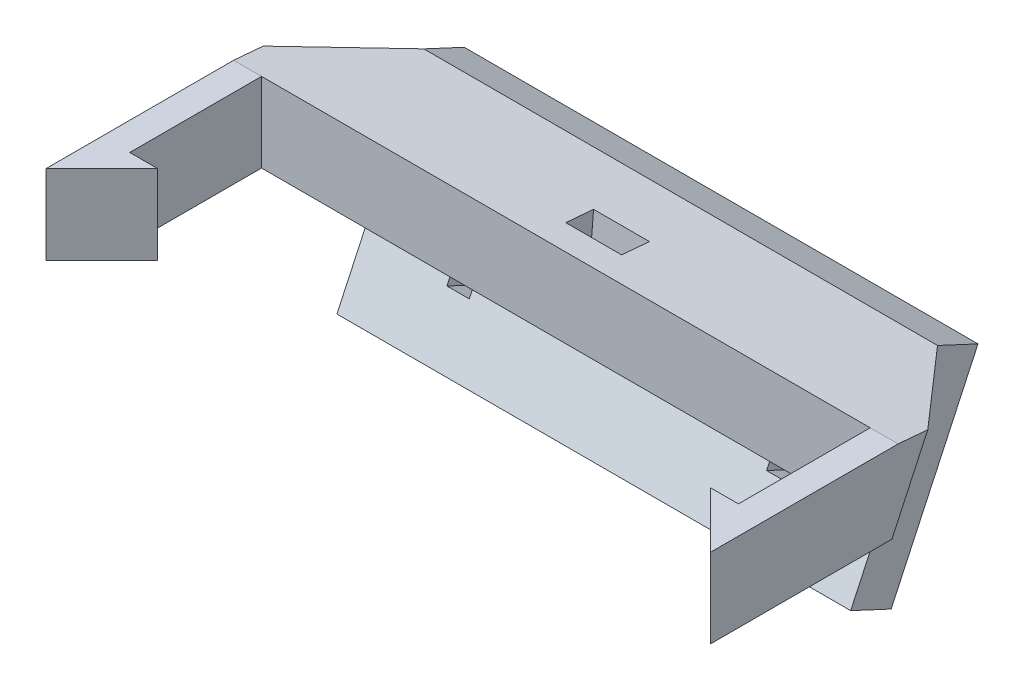
ISO-10303-21;
HEADER;
FILE_DESCRIPTION(('STEP AP214'),'2;1');
FILE_NAME('part.step','',(''),(''),'','','');
FILE_SCHEMA(('AUTOMOTIVE_DESIGN { 1 0 10303 214 1 1 1 1 }'));
ENDSEC;
DATA;
#1=APPLICATION_CONTEXT('core data for automotive mechanical design processes');
#2=APPLICATION_PROTOCOL_DEFINITION('international standard','automotive_design',2000,#1);
#3=PRODUCT_CONTEXT('',#1,'mechanical');
#4=PRODUCT('Part','Part','',(#3));
#5=PRODUCT_RELATED_PRODUCT_CATEGORY('part','',(#4));
#6=PRODUCT_DEFINITION_FORMATION('','',#4);
#7=PRODUCT_DEFINITION_CONTEXT('part definition',#1,'design');
#8=PRODUCT_DEFINITION('design','',#6,#7);
#9=PRODUCT_DEFINITION_SHAPE('','',#8);
#10=(LENGTH_UNIT() NAMED_UNIT(*) SI_UNIT(.MILLI.,.METRE.));
#11=(NAMED_UNIT(*) PLANE_ANGLE_UNIT() SI_UNIT($,.RADIAN.));
#12=(NAMED_UNIT(*) SI_UNIT($,.STERADIAN.) SOLID_ANGLE_UNIT());
#13=UNCERTAINTY_MEASURE_WITH_UNIT(LENGTH_MEASURE(1.E-05),#10,'distance_accuracy_value','');
#14=(GEOMETRIC_REPRESENTATION_CONTEXT(3) GLOBAL_UNCERTAINTY_ASSIGNED_CONTEXT((#13)) GLOBAL_UNIT_ASSIGNED_CONTEXT((#10,
#11,#12)) REPRESENTATION_CONTEXT('',''));
#15=CARTESIAN_POINT('',(0.,0.,0.));
#16=DIRECTION('',(0.,0.,1.));
#17=DIRECTION('',(1.,0.,0.));
#18=AXIS2_PLACEMENT_3D('',#15,#16,#17);
#19=CARTESIAN_POINT('',(37.7825,3.39860036747243,-13.0507435403567));
#20=DIRECTION('',(0.,-0.996366443360063,0.0851698922508354));
#21=DIRECTION('',(0.,-0.0851698922508354,-0.996366443360063));
#22=AXIS2_PLACEMENT_3D('',#19,#20,#21);
#23=PLANE('',#22);
#24=DIRECTION('',(0.,0.0851698922508354,0.996366443360063));
#25=VECTOR('',#24,1.);
#26=CARTESIAN_POINT('',(37.7825,3.39860036747243,-13.0507435403567));
#27=LINE('',#26,#25);
#28=CARTESIAN_POINT('',(37.7825,4.22620582678409,-3.36893831309177));
#29=VERTEX_POINT('',#28);
#30=CARTESIAN_POINT('',(37.7825,4.51418432609816,0.));
#31=VERTEX_POINT('',#30);
#32=EDGE_CURVE('E370',#29,#31,#27,.T.);
#33=ORIENTED_EDGE('',*,*,#32,.F.);
#34=DIRECTION('',(-0.661559883250847,-0.0638682497567785,-0.747167563232058));
#35=VECTOR('',#34,1.);
#36=CARTESIAN_POINT('',(32.9618530298151,3.76081139692824,-8.81339034397362));
#37=LINE('',#36,#35);
#38=CARTESIAN_POINT('',(29.21,3.39860036747242,-13.0507435403567));
#39=VERTEX_POINT('',#38);
#40=EDGE_CURVE('E310',#29,#39,#37,.T.);
#41=ORIENTED_EDGE('',*,*,#40,.T.);
#42=DIRECTION('',(1.,0.,0.));
#43=VECTOR('',#42,1.);
#44=CARTESIAN_POINT('',(37.7825,3.39860036747242,-13.0507435403567));
#45=LINE('',#44,#43);
#46=CARTESIAN_POINT('',(-29.21,3.39860036747242,-13.0507435403567));
#47=VERTEX_POINT('',#46);
#48=EDGE_CURVE('E376',#47,#39,#45,.T.);
#49=ORIENTED_EDGE('',*,*,#48,.F.);
#50=DIRECTION('',(-0.661559883250847,0.0638682497567785,0.747167563232058));
#51=VECTOR('',#50,1.);
#52=CARTESIAN_POINT('',(0.110036640407145,0.567988248391787,-46.164874075054));
#53=LINE('',#52,#51);
#54=CARTESIAN_POINT('',(-37.7825,4.22620582678409,-3.36893831309177));
#55=VERTEX_POINT('',#54);
#56=EDGE_CURVE('E329',#47,#55,#53,.T.);
#57=ORIENTED_EDGE('',*,*,#56,.T.);
#58=DIRECTION('',(0.,0.0851698922508354,0.996366443360063));
#59=VECTOR('',#58,1.);
#60=CARTESIAN_POINT('',(-37.7825,3.39860036747243,-13.0507435403567));
#61=LINE('',#60,#59);
#62=CARTESIAN_POINT('',(-37.7825,4.51418432609816,0.));
#63=VERTEX_POINT('',#62);
#64=EDGE_CURVE('E367',#55,#63,#61,.T.);
#65=ORIENTED_EDGE('',*,*,#64,.T.);
#66=DIRECTION('',(-1.,0.,0.));
#67=VECTOR('',#66,1.);
#68=CARTESIAN_POINT('',(-37.7825,4.51418432609816,0.));
#69=LINE('',#68,#67);
#70=CARTESIAN_POINT('',(-34.6075,4.51418432609816,0.));
#71=VERTEX_POINT('',#70);
#72=EDGE_CURVE('E445',#71,#63,#69,.T.);
#73=ORIENTED_EDGE('',*,*,#72,.F.);
#74=DIRECTION('',(-1.,0.,0.));
#75=VECTOR('',#74,1.);
#76=CARTESIAN_POINT('',(37.7825,4.51418432609816,0.));
#77=LINE('',#76,#75);
#78=CARTESIAN_POINT('',(34.6075,4.51418432609816,0.));
#79=VERTEX_POINT('',#78);
#80=EDGE_CURVE('E372',#79,#71,#77,.T.);
#81=ORIENTED_EDGE('',*,*,#80,.F.);
#82=DIRECTION('',(-1.,0.,0.));
#83=VECTOR('',#82,1.);
#84=CARTESIAN_POINT('',(37.7825,4.51418432609816,0.));
#85=LINE('',#84,#83);
#86=EDGE_CURVE('E416',#31,#79,#85,.T.);
#87=ORIENTED_EDGE('',*,*,#86,.F.);
#88=EDGE_LOOP('',(#33,#41,#49,#57,#65,#73,#81,#87));
#89=FACE_BOUND('',#88,.T.);
#90=DIRECTION('',(0.,0.0851698922508354,0.996366443360063));
#91=VECTOR('',#90,1.);
#92=CARTESIAN_POINT('',(-3.175,3.39860036747242,-13.0507435403567));
#93=LINE('',#92,#91);
#94=CARTESIAN_POINT('',(-3.175,3.97335551030536,-6.3269269153364));
#95=VERTEX_POINT('',#94);
#96=CARTESIAN_POINT('',(-3.175,4.24376991820176,-3.1634634576682));
#97=VERTEX_POINT('',#96);
#98=EDGE_CURVE('E362',#95,#97,#93,.T.);
#99=ORIENTED_EDGE('',*,*,#98,.F.);
#100=DIRECTION('',(-1.,0.,0.));
#101=VECTOR('',#100,1.);
#102=CARTESIAN_POINT('',(37.7825,3.97335551030536,-6.3269269153364));
#103=LINE('',#102,#101);
#104=CARTESIAN_POINT('',(3.175,3.97335551030536,-6.3269269153364));
#105=VERTEX_POINT('',#104);
#106=EDGE_CURVE('E355',#105,#95,#103,.T.);
#107=ORIENTED_EDGE('',*,*,#106,.F.);
#108=DIRECTION('',(0.,-0.0851698922508354,-0.996366443360063));
#109=VECTOR('',#108,1.);
#110=CARTESIAN_POINT('',(3.175,3.39860036747243,-13.0507435403567));
#111=LINE('',#110,#109);
#112=CARTESIAN_POINT('',(3.175,4.24376991820176,-3.1634634576682));
#113=VERTEX_POINT('',#112);
#114=EDGE_CURVE('E357',#113,#105,#111,.T.);
#115=ORIENTED_EDGE('',*,*,#114,.F.);
#116=DIRECTION('',(1.,0.,0.));
#117=VECTOR('',#116,1.);
#118=CARTESIAN_POINT('',(37.7825,4.24376991820176,-3.1634634576682));
#119=LINE('',#118,#117);
#120=EDGE_CURVE('E360',#97,#113,#119,.T.);
#121=ORIENTED_EDGE('',*,*,#120,.F.);
#122=EDGE_LOOP('',(#99,#107,#115,#121));
#123=FACE_BOUND('',#122,.T.);
#124=ADVANCED_FACE('F33',(#89,#123),#23,.F.);
#125=CARTESIAN_POINT('',(37.7825,-8.09963674271568,-7.68902752059396));
#126=DIRECTION('',(0.,0.906307787036649,-0.422618261740701));
#127=DIRECTION('',(0.,0.422618261740701,0.906307787036649));
#128=AXIS2_PLACEMENT_3D('',#125,#126,#127);
#129=PLANE('',#128);
#130=DIRECTION('',(-1.,0.,0.));
#131=VECTOR('',#130,1.);
#132=CARTESIAN_POINT('',(37.7825,-8.09963674271568,-7.68902752059396));
#133=LINE('',#132,#131);
#134=CARTESIAN_POINT('',(29.21,-8.09963674271568,-7.68902752059396));
#135=VERTEX_POINT('',#134);
#136=CARTESIAN_POINT('',(-29.21,-8.09963674271568,-7.68902752059396));
#137=VERTEX_POINT('',#136);
#138=EDGE_CURVE('E365',#135,#137,#133,.T.);
#139=ORIENTED_EDGE('',*,*,#138,.F.);
#140=DIRECTION('',(0.684719618883267,0.308006973598886,0.660523086448012));
#141=VECTOR('',#140,1.);
#142=CARTESIAN_POINT('',(33.2291390994561,-6.29171005804527,-3.81191623354437));
#143=LINE('',#142,#141);
#144=CARTESIAN_POINT('',(37.1806948954591,-4.51418432609816,0.));
#145=VERTEX_POINT('',#144);
#146=EDGE_CURVE('E307',#135,#145,#143,.T.);
#147=ORIENTED_EDGE('',*,*,#146,.T.);
#148=DIRECTION('',(1.,0.,0.));
#149=VECTOR('',#148,1.);
#150=CARTESIAN_POINT('',(37.7825,-4.51418432609816,0.));
#151=LINE('',#150,#149);
#152=CARTESIAN_POINT('',(34.6075,-4.51418432609816,0.));
#153=VERTEX_POINT('',#152);
#154=EDGE_CURVE('E421',#153,#145,#151,.T.);
#155=ORIENTED_EDGE('',*,*,#154,.F.);
#156=DIRECTION('',(-1.,0.,0.));
#157=VECTOR('',#156,1.);
#158=CARTESIAN_POINT('',(37.7825,-4.51418432609816,0.));
#159=LINE('',#158,#157);
#160=CARTESIAN_POINT('',(-34.6075,-4.51418432609816,0.));
#161=VERTEX_POINT('',#160);
#162=EDGE_CURVE('E364',#153,#161,#159,.T.);
#163=ORIENTED_EDGE('',*,*,#162,.T.);
#164=DIRECTION('',(1.,0.,0.));
#165=VECTOR('',#164,1.);
#166=CARTESIAN_POINT('',(-37.7825,-4.51418432609816,0.));
#167=LINE('',#166,#165);
#168=CARTESIAN_POINT('',(-37.1806948954591,-4.51418432609816,0.));
#169=VERTEX_POINT('',#168);
#170=EDGE_CURVE('E440',#169,#161,#167,.T.);
#171=ORIENTED_EDGE('',*,*,#170,.F.);
#172=DIRECTION('',(0.684719618883267,-0.308006973598886,-0.660523086448012));
#173=VECTOR('',#172,1.);
#174=CARTESIAN_POINT('',(2.19882777723072,-22.228248982177,-37.9879342453148));
#175=LINE('',#174,#173);
#176=EDGE_CURVE('E326',#169,#137,#175,.T.);
#177=ORIENTED_EDGE('',*,*,#176,.T.);
#178=EDGE_LOOP('',(#139,#147,#155,#163,#171,#177));
#179=FACE_BOUND('',#178,.T.);
#180=DIRECTION('',(0.,-0.422618261740701,-0.906307787036649));
#181=VECTOR('',#180,1.);
#182=CARTESIAN_POINT('',(-3.175,-9.22511340982129,-10.102620022074));
#183=LINE('',#182,#181);
#184=CARTESIAN_POINT('',(-3.175,-5.59707350368473,-2.32226333547929));
#185=VERTEX_POINT('',#184);
#186=CARTESIAN_POINT('',(-3.175,-7.02604059032113,-5.38669314195141));
#187=VERTEX_POINT('',#186);
#188=EDGE_CURVE('E341',#185,#187,#183,.T.);
#189=ORIENTED_EDGE('',*,*,#188,.F.);
#190=DIRECTION('',(-1.,0.,0.));
#191=VECTOR('',#190,1.);
#192=CARTESIAN_POINT('',(-3.175,-5.59707350368473,-2.32226333547929));
#193=LINE('',#192,#191);
#194=CARTESIAN_POINT('',(3.175,-5.59707350368473,-2.32226333547929));
#195=VERTEX_POINT('',#194);
#196=EDGE_CURVE('E343',#195,#185,#193,.T.);
#197=ORIENTED_EDGE('',*,*,#196,.F.);
#198=DIRECTION('',(0.,0.422618261740701,0.906307787036649));
#199=VECTOR('',#198,1.);
#200=CARTESIAN_POINT('',(3.175,-9.22511340982129,-10.102620022074));
#201=LINE('',#200,#199);
#202=CARTESIAN_POINT('',(3.175,-7.02604059032113,-5.38669314195141));
#203=VERTEX_POINT('',#202);
#204=EDGE_CURVE('E335',#203,#195,#201,.T.);
#205=ORIENTED_EDGE('',*,*,#204,.F.);
#206=DIRECTION('',(1.,0.,0.));
#207=VECTOR('',#206,1.);
#208=CARTESIAN_POINT('',(-3.175,-7.02604059032113,-5.38669314195141));
#209=LINE('',#208,#207);
#210=EDGE_CURVE('E338',#187,#203,#209,.T.);
#211=ORIENTED_EDGE('',*,*,#210,.F.);
#212=EDGE_LOOP('',(#189,#197,#205,#211));
#213=FACE_BOUND('',#212,.T.);
#214=ADVANCED_FACE('F502',(#179,#213),#129,.F.);
#215=CARTESIAN_POINT('',(0.,0.,0.));
#216=DIRECTION('',(0.,0.,1.));
#217=DIRECTION('',(1.,0.,0.));
#218=AXIS2_PLACEMENT_3D('',#215,#216,#217);
#219=PLANE('',#218);
#220=ORIENTED_EDGE('',*,*,#162,.F.);
#221=DIRECTION('',(0.,-1.,0.));
#222=VECTOR('',#221,1.);
#223=CARTESIAN_POINT('',(34.6075,4.51418432609816,0.));
#224=LINE('',#223,#222);
#225=EDGE_CURVE('E424',#79,#153,#224,.T.);
#226=ORIENTED_EDGE('',*,*,#225,.F.);
#227=ORIENTED_EDGE('',*,*,#80,.T.);
#228=DIRECTION('',(0.,1.,0.));
#229=VECTOR('',#228,1.);
#230=CARTESIAN_POINT('',(-34.6075,4.51418432609816,0.));
#231=LINE('',#230,#229);
#232=EDGE_CURVE('E447',#161,#71,#231,.T.);
#233=ORIENTED_EDGE('',*,*,#232,.F.);
#234=EDGE_LOOP('',(#220,#226,#227,#233));
#235=FACE_BOUND('',#234,.T.);
#236=ADVANCED_FACE('F540',(#235),#219,.T.);
#237=CARTESIAN_POINT('',(-37.7825,17.78,-3.175));
#238=DIRECTION('',(-1.,0.,0.));
#239=DIRECTION('',(0.,0.,1.));
#240=AXIS2_PLACEMENT_3D('',#237,#238,#239);
#241=PLANE('',#240);
#242=DIRECTION('',(0.,0.906307787036649,-0.422618261740701));
#243=VECTOR('',#242,1.);
#244=CARTESIAN_POINT('',(-37.7825,-25.0755466554106,10.2946932667179));
#245=LINE('',#244,#243);
#246=CARTESIAN_POINT('',(-37.7825,-4.51418432609816,0.706772550459773));
#247=VERTEX_POINT('',#246);
#248=EDGE_CURVE('E315',#247,#55,#245,.T.);
#249=ORIENTED_EDGE('',*,*,#248,.F.);
#250=DIRECTION('',(0.,0.,-1.));
#251=VECTOR('',#250,1.);
#252=CARTESIAN_POINT('',(-37.7825,-4.51418432609816,14.986));
#253=LINE('',#252,#251);
#254=CARTESIAN_POINT('',(-37.7825,-4.51418432609816,21.336));
#255=VERTEX_POINT('',#254);
#256=EDGE_CURVE('E460',#255,#247,#253,.T.);
#257=ORIENTED_EDGE('',*,*,#256,.F.);
#258=DIRECTION('',(0.,-1.,0.));
#259=VECTOR('',#258,1.);
#260=CARTESIAN_POINT('',(-37.7825,13.4944404471673,21.336));
#261=LINE('',#260,#259);
#262=CARTESIAN_POINT('',(-37.7825,4.51418432609816,21.336));
#263=VERTEX_POINT('',#262);
#264=EDGE_CURVE('E404',#263,#255,#261,.T.);
#265=ORIENTED_EDGE('',*,*,#264,.F.);
#266=DIRECTION('',(0.,0.,-1.));
#267=VECTOR('',#266,1.);
#268=CARTESIAN_POINT('',(-37.7825,4.51418432609816,14.986));
#269=LINE('',#268,#267);
#270=EDGE_CURVE('E444',#263,#63,#269,.T.);
#271=ORIENTED_EDGE('',*,*,#270,.T.);
#272=ORIENTED_EDGE('',*,*,#64,.F.);
#273=EDGE_LOOP('',(#249,#257,#265,#271,#272));
#274=FACE_BOUND('',#273,.T.);
#275=ADVANCED_FACE('F35',(#274),#241,.T.);
#276=CARTESIAN_POINT('',(37.7825,17.78,-3.175));
#277=DIRECTION('',(1.,0.,0.));
#278=DIRECTION('',(0.,0.,-1.));
#279=AXIS2_PLACEMENT_3D('',#276,#277,#278);
#280=PLANE('',#279);
#281=DIRECTION('',(0.,0.906307787036649,-0.422618261740701));
#282=VECTOR('',#281,1.);
#283=CARTESIAN_POINT('',(37.7825,-25.0755466554106,10.2946932667179));
#284=LINE('',#283,#282);
#285=CARTESIAN_POINT('',(37.7825,-4.51418432609816,0.706772550459773));
#286=VERTEX_POINT('',#285);
#287=EDGE_CURVE('E294',#286,#29,#284,.T.);
#288=ORIENTED_EDGE('',*,*,#287,.T.);
#289=ORIENTED_EDGE('',*,*,#32,.T.);
#290=DIRECTION('',(0.,0.,-1.));
#291=VECTOR('',#290,1.);
#292=CARTESIAN_POINT('',(37.7825,4.51418432609816,14.986));
#293=LINE('',#292,#291);
#294=CARTESIAN_POINT('',(37.7825,4.51418432609816,21.336));
#295=VERTEX_POINT('',#294);
#296=EDGE_CURVE('E437',#295,#31,#293,.T.);
#297=ORIENTED_EDGE('',*,*,#296,.F.);
#298=DIRECTION('',(0.,-1.,0.));
#299=VECTOR('',#298,1.);
#300=CARTESIAN_POINT('',(37.7825,13.4944404471673,21.336));
#301=LINE('',#300,#299);
#302=CARTESIAN_POINT('',(37.7825,-4.51418432609816,21.336));
#303=VERTEX_POINT('',#302);
#304=EDGE_CURVE('E394',#295,#303,#301,.T.);
#305=ORIENTED_EDGE('',*,*,#304,.T.);
#306=DIRECTION('',(0.,0.,-1.));
#307=VECTOR('',#306,1.);
#308=CARTESIAN_POINT('',(37.7825,-4.51418432609816,14.986));
#309=LINE('',#308,#307);
#310=EDGE_CURVE('E420',#303,#286,#309,.T.);
#311=ORIENTED_EDGE('',*,*,#310,.T.);
#312=EDGE_LOOP('',(#288,#289,#297,#305,#311));
#313=FACE_BOUND('',#312,.T.);
#314=ADVANCED_FACE('F495',(#313),#280,.T.);
#315=CARTESIAN_POINT('',(-37.7825,-4.51418432609816,14.986));
#316=DIRECTION('',(0.,1.,0.));
#317=DIRECTION('',(0.,0.,1.));
#318=AXIS2_PLACEMENT_3D('',#315,#316,#317);
#319=PLANE('',#318);
#320=ORIENTED_EDGE('',*,*,#256,.T.);
#321=DIRECTION('',(0.64830388108516,0.,-0.761381689936078));
#322=VECTOR('',#321,1.);
#323=CARTESIAN_POINT('',(-44.8308224052121,-4.51418432609816,8.98447037190749));
#324=LINE('',#323,#322);
#325=EDGE_CURVE('E319',#247,#169,#324,.T.);
#326=ORIENTED_EDGE('',*,*,#325,.T.);
#327=ORIENTED_EDGE('',*,*,#170,.T.);
#328=DIRECTION('',(0.,0.,-1.));
#329=VECTOR('',#328,1.);
#330=CARTESIAN_POINT('',(-34.6075,-4.51418432609816,14.986));
#331=LINE('',#330,#329);
#332=CARTESIAN_POINT('',(-34.6075,-4.51418432609816,14.986));
#333=VERTEX_POINT('',#332);
#334=EDGE_CURVE('E457',#333,#161,#331,.T.);
#335=ORIENTED_EDGE('',*,*,#334,.F.);
#336=DIRECTION('',(1.,0.,0.));
#337=VECTOR('',#336,1.);
#338=CARTESIAN_POINT('',(-37.7825,-4.51418432609816,14.986));
#339=LINE('',#338,#337);
#340=CARTESIAN_POINT('',(-31.4325,-4.51418432609816,14.986));
#341=VERTEX_POINT('',#340);
#342=EDGE_CURVE('E400',#333,#341,#339,.T.);
#343=ORIENTED_EDGE('',*,*,#342,.T.);
#344=DIRECTION('',(-0.707106781186547,0.,0.707106781186547));
#345=VECTOR('',#344,1.);
#346=CARTESIAN_POINT('',(-31.4325,-4.51418432609816,14.986));
#347=LINE('',#346,#345);
#348=EDGE_CURVE('E406',#341,#255,#347,.T.);
#349=ORIENTED_EDGE('',*,*,#348,.T.);
#350=EDGE_LOOP('',(#320,#326,#327,#335,#343,#349));
#351=FACE_BOUND('',#350,.T.);
#352=ADVANCED_FACE('F510',(#351),#319,.F.);
#353=CARTESIAN_POINT('',(-34.6075,4.51418432609816,14.986));
#354=DIRECTION('',(-1.,0.,0.));
#355=DIRECTION('',(0.,0.,1.));
#356=AXIS2_PLACEMENT_3D('',#353,#354,#355);
#357=PLANE('',#356);
#358=ORIENTED_EDGE('',*,*,#232,.T.);
#359=DIRECTION('',(0.,0.,-1.));
#360=VECTOR('',#359,1.);
#361=CARTESIAN_POINT('',(-34.6075,4.51418432609816,14.986));
#362=LINE('',#361,#360);
#363=CARTESIAN_POINT('',(-34.6075,4.51418432609816,14.986));
#364=VERTEX_POINT('',#363);
#365=EDGE_CURVE('E454',#364,#71,#362,.T.);
#366=ORIENTED_EDGE('',*,*,#365,.F.);
#367=DIRECTION('',(0.,1.,0.));
#368=VECTOR('',#367,1.);
#369=CARTESIAN_POINT('',(-34.6075,4.51418432609816,14.986));
#370=LINE('',#369,#368);
#371=EDGE_CURVE('E441',#333,#364,#370,.T.);
#372=ORIENTED_EDGE('',*,*,#371,.F.);
#373=ORIENTED_EDGE('',*,*,#334,.T.);
#374=EDGE_LOOP('',(#358,#366,#372,#373));
#375=FACE_BOUND('',#374,.T.);
#376=ADVANCED_FACE('F577',(#375),#357,.F.);
#377=CARTESIAN_POINT('',(-37.7825,4.51418432609816,14.986));
#378=DIRECTION('',(0.,-1.,0.));
#379=DIRECTION('',(0.,0.,-1.));
#380=AXIS2_PLACEMENT_3D('',#377,#378,#379);
#381=PLANE('',#380);
#382=ORIENTED_EDGE('',*,*,#72,.T.);
#383=ORIENTED_EDGE('',*,*,#270,.F.);
#384=DIRECTION('',(0.707106781186548,0.,-0.707106781186548));
#385=VECTOR('',#384,1.);
#386=CARTESIAN_POINT('',(-31.4325,4.51418432609816,14.986));
#387=LINE('',#386,#385);
#388=CARTESIAN_POINT('',(-31.4325,4.51418432609816,14.986));
#389=VERTEX_POINT('',#388);
#390=EDGE_CURVE('E401',#263,#389,#387,.T.);
#391=ORIENTED_EDGE('',*,*,#390,.T.);
#392=DIRECTION('',(-1.,0.,0.));
#393=VECTOR('',#392,1.);
#394=CARTESIAN_POINT('',(-37.7825,4.51418432609816,14.986));
#395=LINE('',#394,#393);
#396=EDGE_CURVE('E403',#389,#364,#395,.T.);
#397=ORIENTED_EDGE('',*,*,#396,.T.);
#398=ORIENTED_EDGE('',*,*,#365,.T.);
#399=EDGE_LOOP('',(#382,#383,#391,#397,#398));
#400=FACE_BOUND('',#399,.T.);
#401=ADVANCED_FACE('F521',(#400),#381,.F.);
#402=CARTESIAN_POINT('',(37.7825,4.51418432609816,14.986));
#403=DIRECTION('',(0.,-1.,0.));
#404=DIRECTION('',(1.,0.,0.));
#405=AXIS2_PLACEMENT_3D('',#402,#403,#404);
#406=PLANE('',#405);
#407=ORIENTED_EDGE('',*,*,#86,.T.);
#408=DIRECTION('',(0.,0.,-1.));
#409=VECTOR('',#408,1.);
#410=CARTESIAN_POINT('',(34.6075,4.51418432609816,14.986));
#411=LINE('',#410,#409);
#412=CARTESIAN_POINT('',(34.6075,4.51418432609816,14.986));
#413=VERTEX_POINT('',#412);
#414=EDGE_CURVE('E434',#413,#79,#411,.T.);
#415=ORIENTED_EDGE('',*,*,#414,.F.);
#416=DIRECTION('',(-1.,0.,0.));
#417=VECTOR('',#416,1.);
#418=CARTESIAN_POINT('',(37.7825,4.51418432609816,14.986));
#419=LINE('',#418,#417);
#420=CARTESIAN_POINT('',(31.4325,4.51418432609816,14.986));
#421=VERTEX_POINT('',#420);
#422=EDGE_CURVE('E385',#413,#421,#419,.T.);
#423=ORIENTED_EDGE('',*,*,#422,.T.);
#424=DIRECTION('',(0.707106781186548,0.,0.707106781186548));
#425=VECTOR('',#424,1.);
#426=CARTESIAN_POINT('',(31.4325,4.51418432609816,14.986));
#427=LINE('',#426,#425);
#428=EDGE_CURVE('E387',#421,#295,#427,.T.);
#429=ORIENTED_EDGE('',*,*,#428,.T.);
#430=ORIENTED_EDGE('',*,*,#296,.T.);
#431=EDGE_LOOP('',(#407,#415,#423,#429,#430));
#432=FACE_BOUND('',#431,.T.);
#433=ADVANCED_FACE('F570',(#432),#406,.F.);
#434=CARTESIAN_POINT('',(34.6075,4.51418432609816,14.986));
#435=DIRECTION('',(1.,0.,0.));
#436=DIRECTION('',(0.,0.,-1.));
#437=AXIS2_PLACEMENT_3D('',#434,#435,#436);
#438=PLANE('',#437);
#439=ORIENTED_EDGE('',*,*,#225,.T.);
#440=DIRECTION('',(0.,0.,-1.));
#441=VECTOR('',#440,1.);
#442=CARTESIAN_POINT('',(34.6075,-4.51418432609816,14.986));
#443=LINE('',#442,#441);
#444=CARTESIAN_POINT('',(34.6075,-4.51418432609816,14.986));
#445=VERTEX_POINT('',#444);
#446=EDGE_CURVE('E431',#445,#153,#443,.T.);
#447=ORIENTED_EDGE('',*,*,#446,.F.);
#448=DIRECTION('',(0.,-1.,0.));
#449=VECTOR('',#448,1.);
#450=CARTESIAN_POINT('',(34.6075,4.51418432609816,14.986));
#451=LINE('',#450,#449);
#452=EDGE_CURVE('E417',#413,#445,#451,.T.);
#453=ORIENTED_EDGE('',*,*,#452,.F.);
#454=ORIENTED_EDGE('',*,*,#414,.T.);
#455=EDGE_LOOP('',(#439,#447,#453,#454));
#456=FACE_BOUND('',#455,.T.);
#457=ADVANCED_FACE('F567',(#456),#438,.F.);
#458=CARTESIAN_POINT('',(37.7825,-4.51418432609816,14.986));
#459=DIRECTION('',(0.,1.,0.));
#460=DIRECTION('',(-1.,0.,0.));
#461=AXIS2_PLACEMENT_3D('',#458,#459,#460);
#462=PLANE('',#461);
#463=ORIENTED_EDGE('',*,*,#154,.T.);
#464=DIRECTION('',(0.64830388108516,0.,0.761381689936078));
#465=VECTOR('',#464,1.);
#466=CARTESIAN_POINT('',(44.8308224052121,-4.51418432609816,8.98447037190749));
#467=LINE('',#466,#465);
#468=EDGE_CURVE('E304',#145,#286,#467,.T.);
#469=ORIENTED_EDGE('',*,*,#468,.T.);
#470=ORIENTED_EDGE('',*,*,#310,.F.);
#471=DIRECTION('',(-0.707106781186547,0.,-0.707106781186548));
#472=VECTOR('',#471,1.);
#473=CARTESIAN_POINT('',(31.4325,-4.51418432609816,14.986));
#474=LINE('',#473,#472);
#475=CARTESIAN_POINT('',(31.4325,-4.51418432609816,14.986));
#476=VERTEX_POINT('',#475);
#477=EDGE_CURVE('E382',#303,#476,#474,.T.);
#478=ORIENTED_EDGE('',*,*,#477,.T.);
#479=DIRECTION('',(1.,0.,0.));
#480=VECTOR('',#479,1.);
#481=CARTESIAN_POINT('',(37.7825,-4.51418432609816,14.986));
#482=LINE('',#481,#480);
#483=EDGE_CURVE('E391',#476,#445,#482,.T.);
#484=ORIENTED_EDGE('',*,*,#483,.T.);
#485=ORIENTED_EDGE('',*,*,#446,.T.);
#486=EDGE_LOOP('',(#463,#469,#470,#478,#484,#485));
#487=FACE_BOUND('',#486,.T.);
#488=ADVANCED_FACE('F499',(#487),#462,.F.);
#489=CARTESIAN_POINT('',(-31.4325,13.4944404471673,14.986));
#490=DIRECTION('',(0.707106781186548,0.,0.707106781186548));
#491=DIRECTION('',(0.707106781186548,0.,-0.707106781186548));
#492=AXIS2_PLACEMENT_3D('',#489,#490,#491);
#493=PLANE('',#492);
#494=ORIENTED_EDGE('',*,*,#390,.F.);
#495=ORIENTED_EDGE('',*,*,#264,.T.);
#496=ORIENTED_EDGE('',*,*,#348,.F.);
#497=DIRECTION('',(0.,-1.,0.));
#498=VECTOR('',#497,1.);
#499=CARTESIAN_POINT('',(-31.4325,13.4944404471673,14.986));
#500=LINE('',#499,#498);
#501=EDGE_CURVE('E409',#389,#341,#500,.T.);
#502=ORIENTED_EDGE('',*,*,#501,.F.);
#503=EDGE_LOOP('',(#494,#495,#496,#502));
#504=FACE_BOUND('',#503,.T.);
#505=ADVANCED_FACE('F517',(#504),#493,.T.);
#506=CARTESIAN_POINT('',(-37.7825,13.4944404471673,14.986));
#507=DIRECTION('',(0.,0.,-1.));
#508=DIRECTION('',(-1.,0.,0.));
#509=AXIS2_PLACEMENT_3D('',#506,#507,#508);
#510=PLANE('',#509);
#511=ORIENTED_EDGE('',*,*,#342,.F.);
#512=ORIENTED_EDGE('',*,*,#371,.T.);
#513=ORIENTED_EDGE('',*,*,#396,.F.);
#514=ORIENTED_EDGE('',*,*,#501,.T.);
#515=EDGE_LOOP('',(#511,#512,#513,#514));
#516=FACE_BOUND('',#515,.T.);
#517=ADVANCED_FACE('F555',(#516),#510,.T.);
#518=CARTESIAN_POINT('',(37.7825,13.4944404471673,14.986));
#519=DIRECTION('',(0.,0.,-1.));
#520=DIRECTION('',(-1.,0.,0.));
#521=AXIS2_PLACEMENT_3D('',#518,#519,#520);
#522=PLANE('',#521);
#523=ORIENTED_EDGE('',*,*,#422,.F.);
#524=ORIENTED_EDGE('',*,*,#452,.T.);
#525=ORIENTED_EDGE('',*,*,#483,.F.);
#526=DIRECTION('',(0.,-1.,0.));
#527=VECTOR('',#526,1.);
#528=CARTESIAN_POINT('',(31.4325,13.4944404471673,14.986));
#529=LINE('',#528,#527);
#530=EDGE_CURVE('E388',#421,#476,#529,.T.);
#531=ORIENTED_EDGE('',*,*,#530,.F.);
#532=EDGE_LOOP('',(#523,#524,#525,#531));
#533=FACE_BOUND('',#532,.T.);
#534=ADVANCED_FACE('F552',(#533),#522,.T.);
#535=CARTESIAN_POINT('',(31.4325,13.4944404471673,14.986));
#536=DIRECTION('',(-0.707106781186547,0.,0.707106781186547));
#537=DIRECTION('',(0.707106781186548,0.,0.707106781186548));
#538=AXIS2_PLACEMENT_3D('',#535,#536,#537);
#539=PLANE('',#538);
#540=ORIENTED_EDGE('',*,*,#428,.F.);
#541=ORIENTED_EDGE('',*,*,#530,.T.);
#542=ORIENTED_EDGE('',*,*,#477,.F.);
#543=ORIENTED_EDGE('',*,*,#304,.F.);
#544=EDGE_LOOP('',(#540,#541,#542,#543));
#545=FACE_BOUND('',#544,.T.);
#546=ADVANCED_FACE('F551',(#545),#539,.T.);
#547=CARTESIAN_POINT('',(37.7825,-19.9269007696428,-7.77904355814618));
#548=DIRECTION('',(0.,0.906307787036649,-0.422618261740701));
#549=DIRECTION('',(0.,0.422618261740701,0.906307787036649));
#550=AXIS2_PLACEMENT_3D('',#547,#548,#549);
#551=PLANE('',#550);
#552=DIRECTION('',(-1.,0.,0.));
#553=VECTOR('',#552,1.);
#554=CARTESIAN_POINT('',(37.7825,-19.9269007696428,-7.77904355814618));
#555=LINE('',#554,#553);
#556=CARTESIAN_POINT('',(29.21,-19.9269007696428,-7.77904355814619));
#557=VERTEX_POINT('',#556);
#558=CARTESIAN_POINT('',(-29.21,-19.9269007696428,-7.77904355814619));
#559=VERTEX_POINT('',#558);
#560=EDGE_CURVE('E377',#557,#559,#555,.T.);
#561=ORIENTED_EDGE('',*,*,#560,.F.);
#562=DIRECTION('',(0.,0.422618261740701,0.906307787036649));
#563=VECTOR('',#562,1.);
#564=CARTESIAN_POINT('',(29.21,-19.9269007696428,-7.77904355814618));
#565=LINE('',#564,#563);
#566=CARTESIAN_POINT('',(29.21,-17.78,-3.175));
#567=VERTEX_POINT('',#566);
#568=EDGE_CURVE('E297',#557,#567,#565,.T.);
#569=ORIENTED_EDGE('',*,*,#568,.T.);
#570=DIRECTION('',(1.,0.,0.));
#571=VECTOR('',#570,1.);
#572=CARTESIAN_POINT('',(-37.7825,-17.78,-3.175));
#573=LINE('',#572,#571);
#574=CARTESIAN_POINT('',(-29.21,-17.78,-3.175));
#575=VERTEX_POINT('',#574);
#576=EDGE_CURVE('E463',#575,#567,#573,.T.);
#577=ORIENTED_EDGE('',*,*,#576,.F.);
#578=DIRECTION('',(0.,-0.422618261740701,-0.906307787036649));
#579=VECTOR('',#578,1.);
#580=CARTESIAN_POINT('',(-29.21,-19.9269007696428,-7.77904355814618));
#581=LINE('',#580,#579);
#582=EDGE_CURVE('E332',#575,#559,#581,.T.);
#583=ORIENTED_EDGE('',*,*,#582,.T.);
#584=EDGE_LOOP('',(#561,#569,#577,#583));
#585=FACE_BOUND('',#584,.T.);
#586=ADVANCED_FACE('F474',(#585),#551,.F.);
#587=CARTESIAN_POINT('',(37.7825,1.25169959782966,-17.6547870985029));
#588=DIRECTION('',(0.,-0.906307787036649,0.422618261740701));
#589=DIRECTION('',(0.,-0.422618261740701,-0.906307787036649));
#590=AXIS2_PLACEMENT_3D('',#587,#588,#589);
#591=PLANE('',#590);
#592=ORIENTED_EDGE('',*,*,#48,.T.);
#593=DIRECTION('',(0.,0.422618261740701,0.906307787036649));
#594=VECTOR('',#593,1.);
#595=CARTESIAN_POINT('',(29.21,1.25169959782966,-17.6547870985029));
#596=LINE('',#595,#594);
#597=CARTESIAN_POINT('',(29.21,1.25169959782966,-17.6547870985029));
#598=VERTEX_POINT('',#597);
#599=EDGE_CURVE('E291',#598,#39,#596,.T.);
#600=ORIENTED_EDGE('',*,*,#599,.F.);
#601=DIRECTION('',(1.,0.,0.));
#602=VECTOR('',#601,1.);
#603=CARTESIAN_POINT('',(37.7825,1.25169959782966,-17.6547870985029));
#604=LINE('',#603,#602);
#605=CARTESIAN_POINT('',(-29.21,1.25169959782966,-17.6547870985029));
#606=VERTEX_POINT('',#605);
#607=EDGE_CURVE('E379',#606,#598,#604,.T.);
#608=ORIENTED_EDGE('',*,*,#607,.F.);
#609=DIRECTION('',(0.,-0.422618261740701,-0.906307787036649));
#610=VECTOR('',#609,1.);
#611=CARTESIAN_POINT('',(-29.21,1.25169959782966,-17.6547870985029));
#612=LINE('',#611,#610);
#613=EDGE_CURVE('E313',#47,#606,#612,.T.);
#614=ORIENTED_EDGE('',*,*,#613,.F.);
#615=EDGE_LOOP('',(#592,#600,#608,#614));
#616=FACE_BOUND('',#615,.T.);
#617=ADVANCED_FACE('F485',(#616),#591,.F.);
#618=CARTESIAN_POINT('',(0.,-6.53861447298083,-14.0221039878513));
#619=DIRECTION('',(0.,0.422618261740701,0.906307787036649));
#620=DIRECTION('',(0.,-0.906307787036649,0.422618261740701));
#621=AXIS2_PLACEMENT_3D('',#618,#619,#620);
#622=PLANE('',#621);
#623=DIRECTION('',(1.,0.,0.));
#624=VECTOR('',#623,1.);
#625=CARTESIAN_POINT('',(-19.5658559979028,-10.325070626359,-12.2564504862629));
#626=LINE('',#625,#624);
#627=CARTESIAN_POINT('',(-19.5658559979028,-10.325070626359,-12.2564504862629));
#628=VERTEX_POINT('',#627);
#629=CARTESIAN_POINT('',(-17.0258559979028,-10.325070626359,-12.2564504862629));
#630=VERTEX_POINT('',#629);
#631=EDGE_CURVE('E246',#628,#630,#626,.T.);
#632=ORIENTED_EDGE('',*,*,#631,.F.);
#633=DIRECTION('',(0.,0.906307787036649,-0.422618261740701));
#634=VECTOR('',#633,1.);
#635=CARTESIAN_POINT('',(-19.5658559979028,-10.325070626359,-12.2564504862629));
#636=LINE('',#635,#634);
#637=CARTESIAN_POINT('',(-19.5658559979028,-13.7781032949686,-10.6462749090309));
#638=VERTEX_POINT('',#637);
#639=EDGE_CURVE('E48',#638,#628,#636,.T.);
#640=ORIENTED_EDGE('',*,*,#639,.F.);
#641=DIRECTION('',(-1.,0.,0.));
#642=VECTOR('',#641,1.);
#643=CARTESIAN_POINT('',(-19.5658559979028,-13.7781032949686,-10.6462749090309));
#644=LINE('',#643,#642);
#645=CARTESIAN_POINT('',(-17.0258559979028,-13.7781032949686,-10.6462749090309));
#646=VERTEX_POINT('',#645);
#647=EDGE_CURVE('E232',#646,#638,#644,.T.);
#648=ORIENTED_EDGE('',*,*,#647,.F.);
#649=DIRECTION('',(0.,-0.906307787036649,0.422618261740701));
#650=VECTOR('',#649,1.);
#651=CARTESIAN_POINT('',(-17.0258559979028,-10.325070626359,-12.2564504862629));
#652=LINE('',#651,#650);
#653=EDGE_CURVE('E252',#630,#646,#652,.T.);
#654=ORIENTED_EDGE('',*,*,#653,.F.);
#655=EDGE_LOOP('',(#632,#640,#648,#654));
#656=FACE_BOUND('',#655,.T.);
#657=DIRECTION('',(-1.,0.,0.));
#658=VECTOR('',#657,1.);
#659=CARTESIAN_POINT('',(19.3205422549951,-13.7781032949686,-10.6462749090309));
#660=LINE('',#659,#658);
#661=CARTESIAN_POINT('',(19.3205422549951,-13.7781032949686,-10.6462749090309));
#662=VERTEX_POINT('',#661);
#663=CARTESIAN_POINT('',(16.7805422549951,-13.7781032949686,-10.6462749090309));
#664=VERTEX_POINT('',#663);
#665=EDGE_CURVE('E270',#662,#664,#660,.T.);
#666=ORIENTED_EDGE('',*,*,#665,.F.);
#667=DIRECTION('',(0.,-0.906307787036649,0.422618261740701));
#668=VECTOR('',#667,1.);
#669=CARTESIAN_POINT('',(19.3205422549951,-10.325070626359,-12.2564504862629));
#670=LINE('',#669,#668);
#671=CARTESIAN_POINT('',(19.3205422549951,-10.325070626359,-12.2564504862629));
#672=VERTEX_POINT('',#671);
#673=EDGE_CURVE('E268',#672,#662,#670,.T.);
#674=ORIENTED_EDGE('',*,*,#673,.F.);
#675=DIRECTION('',(1.,0.,0.));
#676=VECTOR('',#675,1.);
#677=CARTESIAN_POINT('',(19.3205422549951,-10.325070626359,-12.2564504862629));
#678=LINE('',#677,#676);
#679=CARTESIAN_POINT('',(16.7805422549951,-10.325070626359,-12.2564504862629));
#680=VERTEX_POINT('',#679);
#681=EDGE_CURVE('E276',#680,#672,#678,.T.);
#682=ORIENTED_EDGE('',*,*,#681,.F.);
#683=DIRECTION('',(0.,0.906307787036649,-0.422618261740701));
#684=VECTOR('',#683,1.);
#685=CARTESIAN_POINT('',(16.7805422549951,-10.325070626359,-12.2564504862629));
#686=LINE('',#685,#684);
#687=EDGE_CURVE('E273',#664,#680,#686,.T.);
#688=ORIENTED_EDGE('',*,*,#687,.F.);
#689=EDGE_LOOP('',(#666,#674,#682,#688));
#690=FACE_BOUND('',#689,.T.);
#691=ORIENTED_EDGE('',*,*,#607,.T.);
#692=DIRECTION('',(0.,0.906307787036649,-0.422618261740701));
#693=VECTOR('',#692,1.);
#694=CARTESIAN_POINT('',(29.21,-31.0786094340852,-2.57891640640319));
#695=LINE('',#694,#693);
#696=EDGE_CURVE('E298',#557,#598,#695,.T.);
#697=ORIENTED_EDGE('',*,*,#696,.F.);
#698=ORIENTED_EDGE('',*,*,#560,.T.);
#699=DIRECTION('',(0.,0.906307787036649,-0.422618261740701));
#700=VECTOR('',#699,1.);
#701=CARTESIAN_POINT('',(-29.21,-31.0786094340852,-2.57891640640319));
#702=LINE('',#701,#700);
#703=EDGE_CURVE('E316',#559,#606,#702,.T.);
#704=ORIENTED_EDGE('',*,*,#703,.T.);
#705=EDGE_LOOP('',(#691,#697,#698,#704));
#706=FACE_BOUND('',#705,.T.);
#707=ADVANCED_FACE('F480',(#656,#690,#706),#622,.F.);
#708=CARTESIAN_POINT('',(37.7825,-17.78,-3.175));
#709=DIRECTION('',(0.,-0.422618261740701,-0.906307787036649));
#710=DIRECTION('',(0.,0.906307787036649,-0.422618261740701));
#711=AXIS2_PLACEMENT_3D('',#708,#709,#710);
#712=PLANE('',#711);
#713=DIRECTION('',(1.,0.,0.));
#714=VECTOR('',#713,1.);
#715=CARTESIAN_POINT('',(-19.5658559979028,-11.6312025253259,-6.04223135088467));
#716=LINE('',#715,#714);
#717=CARTESIAN_POINT('',(-19.5658559979028,-11.6312025253259,-6.04223135088468));
#718=VERTEX_POINT('',#717);
#719=CARTESIAN_POINT('',(-17.0258559979028,-11.6312025253259,-6.04223135088466));
#720=VERTEX_POINT('',#719);
#721=EDGE_CURVE('E244',#718,#720,#716,.T.);
#722=ORIENTED_EDGE('',*,*,#721,.F.);
#723=DIRECTION('',(0.,-0.906307787036649,0.422618261740701));
#724=VECTOR('',#723,1.);
#725=CARTESIAN_POINT('',(-19.5658559979028,-8.17816985671625,-7.65240692811674));
#726=LINE('',#725,#724);
#727=CARTESIAN_POINT('',(-19.5658559979028,-8.17816985671625,-7.65240692811674));
#728=VERTEX_POINT('',#727);
#729=EDGE_CURVE('E226',#728,#718,#726,.T.);
#730=ORIENTED_EDGE('',*,*,#729,.F.);
#731=DIRECTION('',(-1.,0.,0.));
#732=VECTOR('',#731,1.);
#733=CARTESIAN_POINT('',(-19.5658559979028,-8.17816985671625,-7.65240692811674));
#734=LINE('',#733,#732);
#735=CARTESIAN_POINT('',(-17.0258559979028,-8.17816985671625,-7.65240692811674));
#736=VERTEX_POINT('',#735);
#737=EDGE_CURVE('E235',#736,#728,#734,.T.);
#738=ORIENTED_EDGE('',*,*,#737,.F.);
#739=DIRECTION('',(0.,0.906307787036649,-0.422618261740701));
#740=VECTOR('',#739,1.);
#741=CARTESIAN_POINT('',(-17.0258559979028,-8.17816985671625,-7.65240692811674));
#742=LINE('',#741,#740);
#743=EDGE_CURVE('E56',#720,#736,#742,.T.);
#744=ORIENTED_EDGE('',*,*,#743,.F.);
#745=EDGE_LOOP('',(#722,#730,#738,#744));
#746=FACE_BOUND('',#745,.T.);
#747=DIRECTION('',(-1.,0.,0.));
#748=VECTOR('',#747,1.);
#749=CARTESIAN_POINT('',(19.3205422549951,-8.17816985671625,-7.65240692811674));
#750=LINE('',#749,#748);
#751=CARTESIAN_POINT('',(19.3205422549951,-8.17816985671625,-7.65240692811675));
#752=VERTEX_POINT('',#751);
#753=CARTESIAN_POINT('',(16.7805422549951,-8.17816985671624,-7.65240692811673));
#754=VERTEX_POINT('',#753);
#755=EDGE_CURVE('E262',#752,#754,#750,.T.);
#756=ORIENTED_EDGE('',*,*,#755,.F.);
#757=DIRECTION('',(0.,0.906307787036649,-0.422618261740701));
#758=VECTOR('',#757,1.);
#759=CARTESIAN_POINT('',(19.3205422549951,-8.17816985671625,-7.65240692811674));
#760=LINE('',#759,#758);
#761=CARTESIAN_POINT('',(19.3205422549951,-11.6312025253259,-6.04223135088467));
#762=VERTEX_POINT('',#761);
#763=EDGE_CURVE('E265',#762,#752,#760,.T.);
#764=ORIENTED_EDGE('',*,*,#763,.F.);
#765=DIRECTION('',(1.,0.,0.));
#766=VECTOR('',#765,1.);
#767=CARTESIAN_POINT('',(19.3205422549951,-11.6312025253259,-6.04223135088467));
#768=LINE('',#767,#766);
#769=CARTESIAN_POINT('',(16.7805422549951,-11.6312025253259,-6.04223135088467));
#770=VERTEX_POINT('',#769);
#771=EDGE_CURVE('E282',#770,#762,#768,.T.);
#772=ORIENTED_EDGE('',*,*,#771,.F.);
#773=DIRECTION('',(0.,-0.906307787036649,0.422618261740701));
#774=VECTOR('',#773,1.);
#775=CARTESIAN_POINT('',(16.7805422549951,-8.17816985671625,-7.65240692811674));
#776=LINE('',#775,#774);
#777=EDGE_CURVE('E238',#754,#770,#776,.T.);
#778=ORIENTED_EDGE('',*,*,#777,.F.);
#779=EDGE_LOOP('',(#756,#764,#772,#778));
#780=FACE_BOUND('',#779,.T.);
#781=ORIENTED_EDGE('',*,*,#576,.T.);
#782=DIRECTION('',(0.,0.906307787036649,-0.422618261740701));
#783=VECTOR('',#782,1.);
#784=CARTESIAN_POINT('',(29.21,-17.78,-3.175));
#785=LINE('',#784,#783);
#786=EDGE_CURVE('E11',#567,#135,#785,.T.);
#787=ORIENTED_EDGE('',*,*,#786,.T.);
#788=ORIENTED_EDGE('',*,*,#138,.T.);
#789=DIRECTION('',(0.,-0.906307787036649,0.422618261740701));
#790=VECTOR('',#789,1.);
#791=CARTESIAN_POINT('',(-29.21,-17.78,-3.175));
#792=LINE('',#791,#790);
#793=EDGE_CURVE('E41',#137,#575,#792,.T.);
#794=ORIENTED_EDGE('',*,*,#793,.T.);
#795=EDGE_LOOP('',(#781,#787,#788,#794));
#796=FACE_BOUND('',#795,.T.);
#797=ADVANCED_FACE('F241',(#746,#780,#796),#712,.F.);
#798=CARTESIAN_POINT('',(-3.175,5.47154820480913,-6.45499316165795));
#799=DIRECTION('',(1.,0.,0.));
#800=DIRECTION('',(0.,0.,-1.));
#801=AXIS2_PLACEMENT_3D('',#798,#799,#800);
#802=PLANE('',#801);
#803=ORIENTED_EDGE('',*,*,#98,.T.);
#804=DIRECTION('',(0.,-0.996366443360063,0.0851698922508354));
#805=VECTOR('',#804,1.);
#806=CARTESIAN_POINT('',(-3.175,5.74196261270553,-3.29152970398975));
#807=LINE('',#806,#805);
#808=EDGE_CURVE('E353',#97,#185,#807,.T.);
#809=ORIENTED_EDGE('',*,*,#808,.T.);
#810=ORIENTED_EDGE('',*,*,#188,.T.);
#811=DIRECTION('',(0.,-0.996366443360063,0.0851698922508354));
#812=VECTOR('',#811,1.);
#813=CARTESIAN_POINT('',(-3.175,5.47154820480913,-6.45499316165795));
#814=LINE('',#813,#812);
#815=EDGE_CURVE('E346',#95,#187,#814,.T.);
#816=ORIENTED_EDGE('',*,*,#815,.F.);
#817=EDGE_LOOP('',(#803,#809,#810,#816));
#818=FACE_BOUND('',#817,.T.);
#819=ADVANCED_FACE('F633',(#818),#802,.T.);
#820=CARTESIAN_POINT('',(-3.175,5.74196261270553,-3.29152970398975));
#821=DIRECTION('',(0.,-0.0851698922508354,-0.996366443360063));
#822=DIRECTION('',(0.,0.996366443360063,-0.0851698922508354));
#823=AXIS2_PLACEMENT_3D('',#820,#821,#822);
#824=PLANE('',#823);
#825=ORIENTED_EDGE('',*,*,#120,.T.);
#826=DIRECTION('',(0.,-0.996366443360063,0.0851698922508354));
#827=VECTOR('',#826,1.);
#828=CARTESIAN_POINT('',(3.175,5.74196261270553,-3.29152970398975));
#829=LINE('',#828,#827);
#830=EDGE_CURVE('E351',#113,#195,#829,.T.);
#831=ORIENTED_EDGE('',*,*,#830,.T.);
#832=ORIENTED_EDGE('',*,*,#196,.T.);
#833=ORIENTED_EDGE('',*,*,#808,.F.);
#834=EDGE_LOOP('',(#825,#831,#832,#833));
#835=FACE_BOUND('',#834,.T.);
#836=ADVANCED_FACE('F623',(#835),#824,.T.);
#837=CARTESIAN_POINT('',(3.175,5.47154820480913,-6.45499316165795));
#838=DIRECTION('',(-1.,0.,0.));
#839=DIRECTION('',(0.,0.,1.));
#840=AXIS2_PLACEMENT_3D('',#837,#838,#839);
#841=PLANE('',#840);
#842=ORIENTED_EDGE('',*,*,#114,.T.);
#843=DIRECTION('',(0.,-0.996366443360063,0.0851698922508354));
#844=VECTOR('',#843,1.);
#845=CARTESIAN_POINT('',(3.175,5.47154820480913,-6.45499316165795));
#846=LINE('',#845,#844);
#847=EDGE_CURVE('E349',#105,#203,#846,.T.);
#848=ORIENTED_EDGE('',*,*,#847,.T.);
#849=ORIENTED_EDGE('',*,*,#204,.T.);
#850=ORIENTED_EDGE('',*,*,#830,.F.);
#851=EDGE_LOOP('',(#842,#848,#849,#850));
#852=FACE_BOUND('',#851,.T.);
#853=ADVANCED_FACE('F531',(#852),#841,.T.);
#854=CARTESIAN_POINT('',(-3.175,5.47154820480913,-6.45499316165795));
#855=DIRECTION('',(0.,0.0851698922508354,0.996366443360063));
#856=DIRECTION('',(0.,-0.996366443360063,0.0851698922508354));
#857=AXIS2_PLACEMENT_3D('',#854,#855,#856);
#858=PLANE('',#857);
#859=ORIENTED_EDGE('',*,*,#106,.T.);
#860=ORIENTED_EDGE('',*,*,#815,.T.);
#861=ORIENTED_EDGE('',*,*,#210,.T.);
#862=ORIENTED_EDGE('',*,*,#847,.F.);
#863=EDGE_LOOP('',(#859,#860,#861,#862));
#864=FACE_BOUND('',#863,.T.);
#865=ADVANCED_FACE('F524',(#864),#858,.T.);
#866=CARTESIAN_POINT('',(-29.21,-31.0786094340852,-2.57891640640319));
#867=DIRECTION('',(1.,0.,0.));
#868=DIRECTION('',(0.,0.,-1.));
#869=AXIS2_PLACEMENT_3D('',#866,#867,#868);
#870=PLANE('',#869);
#871=ORIENTED_EDGE('',*,*,#793,.F.);
#872=DIRECTION('',(0.,0.906307787036649,-0.422618261740701));
#873=VECTOR('',#872,1.);
#874=CARTESIAN_POINT('',(-29.21,-28.9317086644425,2.02512715174299));
#875=LINE('',#874,#873);
#876=EDGE_CURVE('E320',#137,#47,#875,.T.);
#877=ORIENTED_EDGE('',*,*,#876,.T.);
#878=ORIENTED_EDGE('',*,*,#613,.T.);
#879=ORIENTED_EDGE('',*,*,#703,.F.);
#880=ORIENTED_EDGE('',*,*,#582,.F.);
#881=EDGE_LOOP('',(#871,#877,#878,#879,#880));
#882=FACE_BOUND('',#881,.T.);
#883=ADVANCED_FACE('F522',(#882),#870,.F.);
#884=CARTESIAN_POINT('',(-29.21,-28.9317086644425,2.02512715174299));
#885=DIRECTION('',(0.728806588551691,0.289375015112202,0.620566722530672));
#886=DIRECTION('',(0.64830388108516,0.,-0.761381689936078));
#887=AXIS2_PLACEMENT_3D('',#884,#885,#886);
#888=PLANE('',#887);
#889=ORIENTED_EDGE('',*,*,#876,.F.);
#890=ORIENTED_EDGE('',*,*,#176,.F.);
#891=ORIENTED_EDGE('',*,*,#325,.F.);
#892=ORIENTED_EDGE('',*,*,#248,.T.);
#893=ORIENTED_EDGE('',*,*,#56,.F.);
#894=EDGE_LOOP('',(#889,#890,#891,#892,#893));
#895=FACE_BOUND('',#894,.T.);
#896=ADVANCED_FACE('F507',(#895),#888,.F.);
#897=CARTESIAN_POINT('',(29.21,-28.9317086644425,2.02512715174299));
#898=DIRECTION('',(-0.728806588551691,0.289375015112202,0.620566722530672));
#899=DIRECTION('',(0.64830388108516,0.,0.761381689936078));
#900=AXIS2_PLACEMENT_3D('',#897,#898,#899);
#901=PLANE('',#900);
#902=ORIENTED_EDGE('',*,*,#287,.F.);
#903=ORIENTED_EDGE('',*,*,#468,.F.);
#904=ORIENTED_EDGE('',*,*,#146,.F.);
#905=DIRECTION('',(0.,0.906307787036649,-0.422618261740701));
#906=VECTOR('',#905,1.);
#907=CARTESIAN_POINT('',(29.21,-28.9317086644425,2.02512715174299));
#908=LINE('',#907,#906);
#909=EDGE_CURVE('E295',#135,#39,#908,.T.);
#910=ORIENTED_EDGE('',*,*,#909,.T.);
#911=ORIENTED_EDGE('',*,*,#40,.F.);
#912=EDGE_LOOP('',(#902,#903,#904,#910,#911));
#913=FACE_BOUND('',#912,.T.);
#914=ADVANCED_FACE('F493',(#913),#901,.F.);
#915=CARTESIAN_POINT('',(29.21,-31.0786094340852,-2.57891640640319));
#916=DIRECTION('',(-1.,0.,0.));
#917=DIRECTION('',(0.,0.,1.));
#918=AXIS2_PLACEMENT_3D('',#915,#916,#917);
#919=PLANE('',#918);
#920=ORIENTED_EDGE('',*,*,#696,.T.);
#921=ORIENTED_EDGE('',*,*,#599,.T.);
#922=ORIENTED_EDGE('',*,*,#909,.F.);
#923=ORIENTED_EDGE('',*,*,#786,.F.);
#924=ORIENTED_EDGE('',*,*,#568,.F.);
#925=EDGE_LOOP('',(#920,#921,#922,#923,#924));
#926=FACE_BOUND('',#925,.T.);
#927=ADVANCED_FACE('F477',(#926),#919,.F.);
#928=CARTESIAN_POINT('',(19.3205422549951,5.19252888095236,21.0211490468619));
#929=DIRECTION('',(1.,0.,0.));
#930=DIRECTION('',(0.,0.,-1.));
#931=AXIS2_PLACEMENT_3D('',#928,#929,#930);
#932=PLANE('',#931);
#933=ORIENTED_EDGE('',*,*,#763,.T.);
#934=DIRECTION('',(0.,-0.422618261740701,-0.906307787036649));
#935=VECTOR('',#934,1.);
#936=CARTESIAN_POINT('',(19.3205422549951,5.19252888095236,21.0211490468619));
#937=LINE('',#936,#935);
#938=EDGE_CURVE('E280',#752,#672,#937,.T.);
#939=ORIENTED_EDGE('',*,*,#938,.T.);
#940=ORIENTED_EDGE('',*,*,#673,.T.);
#941=DIRECTION('',(0.,-0.422618261740701,-0.906307787036649));
#942=VECTOR('',#941,1.);
#943=CARTESIAN_POINT('',(19.3205422549951,1.73949621234273,22.631324624094));
#944=LINE('',#943,#942);
#945=EDGE_CURVE('E279',#762,#662,#944,.T.);
#946=ORIENTED_EDGE('',*,*,#945,.F.);
#947=EDGE_LOOP('',(#933,#939,#940,#946));
#948=FACE_BOUND('',#947,.T.);
#949=ADVANCED_FACE('F724',(#948),#932,.F.);
#950=CARTESIAN_POINT('',(19.3205422549951,5.19252888095236,21.0211490468619));
#951=DIRECTION('',(0.,0.906307787036649,-0.422618261740701));
#952=DIRECTION('',(0.,0.422618261740701,0.906307787036649));
#953=AXIS2_PLACEMENT_3D('',#950,#951,#952);
#954=PLANE('',#953);
#955=ORIENTED_EDGE('',*,*,#755,.T.);
#956=DIRECTION('',(0.,-0.422618261740701,-0.906307787036649));
#957=VECTOR('',#956,1.);
#958=CARTESIAN_POINT('',(16.7805422549951,5.19252888095236,21.0211490468619));
#959=LINE('',#958,#957);
#960=EDGE_CURVE('E283',#754,#680,#959,.T.);
#961=ORIENTED_EDGE('',*,*,#960,.T.);
#962=ORIENTED_EDGE('',*,*,#681,.T.);
#963=ORIENTED_EDGE('',*,*,#938,.F.);
#964=EDGE_LOOP('',(#955,#961,#962,#963));
#965=FACE_BOUND('',#964,.T.);
#966=ADVANCED_FACE('F743',(#965),#954,.F.);
#967=CARTESIAN_POINT('',(16.7805422549951,5.19252888095236,21.0211490468619));
#968=DIRECTION('',(-1.,0.,0.));
#969=DIRECTION('',(0.,0.,1.));
#970=AXIS2_PLACEMENT_3D('',#967,#968,#969);
#971=PLANE('',#970);
#972=ORIENTED_EDGE('',*,*,#777,.T.);
#973=DIRECTION('',(0.,-0.422618261740701,-0.906307787036649));
#974=VECTOR('',#973,1.);
#975=CARTESIAN_POINT('',(16.7805422549951,1.73949621234273,22.631324624094));
#976=LINE('',#975,#974);
#977=EDGE_CURVE('E285',#770,#664,#976,.T.);
#978=ORIENTED_EDGE('',*,*,#977,.T.);
#979=ORIENTED_EDGE('',*,*,#687,.T.);
#980=ORIENTED_EDGE('',*,*,#960,.F.);
#981=EDGE_LOOP('',(#972,#978,#979,#980));
#982=FACE_BOUND('',#981,.T.);
#983=ADVANCED_FACE('F753',(#982),#971,.F.);
#984=CARTESIAN_POINT('',(19.3205422549951,1.73949621234273,22.631324624094));
#985=DIRECTION('',(0.,-0.906307787036649,0.422618261740701));
#986=DIRECTION('',(0.,-0.422618261740701,-0.906307787036649));
#987=AXIS2_PLACEMENT_3D('',#984,#985,#986);
#988=PLANE('',#987);
#989=ORIENTED_EDGE('',*,*,#771,.T.);
#990=ORIENTED_EDGE('',*,*,#945,.T.);
#991=ORIENTED_EDGE('',*,*,#665,.T.);
#992=ORIENTED_EDGE('',*,*,#977,.F.);
#993=EDGE_LOOP('',(#989,#990,#991,#992));
#994=FACE_BOUND('',#993,.T.);
#995=ADVANCED_FACE('F763',(#994),#988,.F.);
#996=CARTESIAN_POINT('',(-19.5658559979028,5.19252888095236,21.0211490468619));
#997=DIRECTION('',(-1.,0.,0.));
#998=DIRECTION('',(0.,0.,1.));
#999=AXIS2_PLACEMENT_3D('',#996,#997,#998);
#1000=PLANE('',#999);
#1001=ORIENTED_EDGE('',*,*,#729,.T.);
#1002=DIRECTION('',(0.,-0.422618261740701,-0.906307787036649));
#1003=VECTOR('',#1002,1.);
#1004=CARTESIAN_POINT('',(-19.5658559979028,1.73949621234273,22.631324624094));
#1005=LINE('',#1004,#1003);
#1006=EDGE_CURVE('E239',#718,#638,#1005,.T.);
#1007=ORIENTED_EDGE('',*,*,#1006,.T.);
#1008=ORIENTED_EDGE('',*,*,#639,.T.);
#1009=DIRECTION('',(0.,-0.422618261740701,-0.906307787036649));
#1010=VECTOR('',#1009,1.);
#1011=CARTESIAN_POINT('',(-19.5658559979028,5.19252888095236,21.0211490468619));
#1012=LINE('',#1011,#1010);
#1013=EDGE_CURVE('E222',#728,#628,#1012,.T.);
#1014=ORIENTED_EDGE('',*,*,#1013,.F.);
#1015=EDGE_LOOP('',(#1001,#1007,#1008,#1014));
#1016=FACE_BOUND('',#1015,.T.);
#1017=ADVANCED_FACE('F224',(#1016),#1000,.F.);
#1018=CARTESIAN_POINT('',(-19.5658559979028,1.73949621234273,22.631324624094));
#1019=DIRECTION('',(0.,-0.906307787036649,0.422618261740701));
#1020=DIRECTION('',(0.,-0.422618261740701,-0.906307787036649));
#1021=AXIS2_PLACEMENT_3D('',#1018,#1019,#1020);
#1022=PLANE('',#1021);
#1023=ORIENTED_EDGE('',*,*,#721,.T.);
#1024=DIRECTION('',(0.,-0.422618261740701,-0.906307787036649));
#1025=VECTOR('',#1024,1.);
#1026=CARTESIAN_POINT('',(-17.0258559979028,1.73949621234273,22.631324624094));
#1027=LINE('',#1026,#1025);
#1028=EDGE_CURVE('E258',#720,#646,#1027,.T.);
#1029=ORIENTED_EDGE('',*,*,#1028,.T.);
#1030=ORIENTED_EDGE('',*,*,#647,.T.);
#1031=ORIENTED_EDGE('',*,*,#1006,.F.);
#1032=EDGE_LOOP('',(#1023,#1029,#1030,#1031));
#1033=FACE_BOUND('',#1032,.T.);
#1034=ADVANCED_FACE('F782',(#1033),#1022,.F.);
#1035=CARTESIAN_POINT('',(-17.0258559979028,5.19252888095236,21.0211490468619));
#1036=DIRECTION('',(1.,0.,0.));
#1037=DIRECTION('',(0.,0.,-1.));
#1038=AXIS2_PLACEMENT_3D('',#1035,#1036,#1037);
#1039=PLANE('',#1038);
#1040=ORIENTED_EDGE('',*,*,#743,.T.);
#1041=DIRECTION('',(0.,-0.422618261740701,-0.906307787036649));
#1042=VECTOR('',#1041,1.);
#1043=CARTESIAN_POINT('',(-17.0258559979028,5.19252888095236,21.0211490468619));
#1044=LINE('',#1043,#1042);
#1045=EDGE_CURVE('E231',#736,#630,#1044,.T.);
#1046=ORIENTED_EDGE('',*,*,#1045,.T.);
#1047=ORIENTED_EDGE('',*,*,#653,.T.);
#1048=ORIENTED_EDGE('',*,*,#1028,.F.);
#1049=EDGE_LOOP('',(#1040,#1046,#1047,#1048));
#1050=FACE_BOUND('',#1049,.T.);
#1051=ADVANCED_FACE('F791',(#1050),#1039,.F.);
#1052=CARTESIAN_POINT('',(-19.5658559979028,5.19252888095236,21.0211490468619));
#1053=DIRECTION('',(0.,0.906307787036649,-0.422618261740701));
#1054=DIRECTION('',(0.,0.422618261740701,0.906307787036649));
#1055=AXIS2_PLACEMENT_3D('',#1052,#1053,#1054);
#1056=PLANE('',#1055);
#1057=ORIENTED_EDGE('',*,*,#737,.T.);
#1058=ORIENTED_EDGE('',*,*,#1013,.T.);
#1059=ORIENTED_EDGE('',*,*,#631,.T.);
#1060=ORIENTED_EDGE('',*,*,#1045,.F.);
#1061=EDGE_LOOP('',(#1057,#1058,#1059,#1060));
#1062=FACE_BOUND('',#1061,.T.);
#1063=ADVANCED_FACE('F236',(#1062),#1056,.F.);
#1064=CLOSED_SHELL('',(#124,#214,#236,#275,#314,#352,#376,#401,#433,#457,#488,#505,#517,#534,
#546,#586,#617,#707,#797,#819,#836,#853,#865,#883,#896,#914,#927,#949,#966,#983,#995,#1017,
#1034,#1051,#1063));
#1065=MANIFOLD_SOLID_BREP('B2',#1064);
#1066=ADVANCED_BREP_SHAPE_REPRESENTATION('',(#18,#1065),#14);
#1067=SHAPE_DEFINITION_REPRESENTATION(#9,#1066);
ENDSEC;
END-ISO-10303-21;
